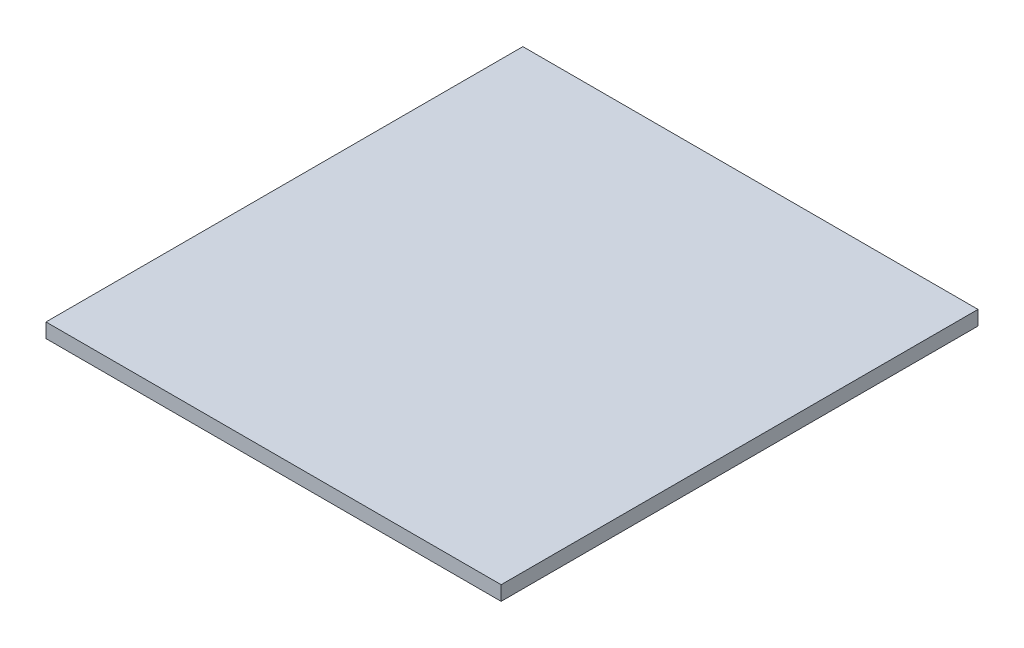
ISO-10303-21;
HEADER;
FILE_DESCRIPTION(('STEP AP214'),'2;1');
FILE_NAME('part.step','',(''),(''),'','','');
FILE_SCHEMA(('AUTOMOTIVE_DESIGN { 1 0 10303 214 1 1 1 1 }'));
ENDSEC;
DATA;
#1=APPLICATION_CONTEXT('core data for automotive mechanical design processes');
#2=APPLICATION_PROTOCOL_DEFINITION('international standard','automotive_design',2000,#1);
#3=PRODUCT_CONTEXT('',#1,'mechanical');
#4=PRODUCT('Part','Part','',(#3));
#5=PRODUCT_RELATED_PRODUCT_CATEGORY('part','',(#4));
#6=PRODUCT_DEFINITION_FORMATION('','',#4);
#7=PRODUCT_DEFINITION_CONTEXT('part definition',#1,'design');
#8=PRODUCT_DEFINITION('design','',#6,#7);
#9=PRODUCT_DEFINITION_SHAPE('','',#8);
#10=(LENGTH_UNIT() NAMED_UNIT(*) SI_UNIT(.MILLI.,.METRE.));
#11=(NAMED_UNIT(*) PLANE_ANGLE_UNIT() SI_UNIT($,.RADIAN.));
#12=(NAMED_UNIT(*) SI_UNIT($,.STERADIAN.) SOLID_ANGLE_UNIT());
#13=UNCERTAINTY_MEASURE_WITH_UNIT(LENGTH_MEASURE(1.E-05),#10,'distance_accuracy_value','');
#14=(GEOMETRIC_REPRESENTATION_CONTEXT(3) GLOBAL_UNCERTAINTY_ASSIGNED_CONTEXT((#13)) GLOBAL_UNIT_ASSIGNED_CONTEXT((#10,
#11,#12)) REPRESENTATION_CONTEXT('',''));
#15=CARTESIAN_POINT('',(0.,0.,0.));
#16=DIRECTION('',(0.,0.,1.));
#17=DIRECTION('',(1.,0.,0.));
#18=AXIS2_PLACEMENT_3D('',#15,#16,#17);
#19=CARTESIAN_POINT('',(100.,3.175,104.775));
#20=DIRECTION('',(-1.,0.,0.));
#21=DIRECTION('',(0.,0.,1.));
#22=AXIS2_PLACEMENT_3D('',#19,#20,#21);
#23=PLANE('',#22);
#24=DIRECTION('',(0.,0.,-1.));
#25=VECTOR('',#24,1.);
#26=CARTESIAN_POINT('',(100.,-3.175,104.775));
#27=LINE('',#26,#25);
#28=CARTESIAN_POINT('',(100.,-3.175,104.775));
#29=VERTEX_POINT('',#28);
#30=CARTESIAN_POINT('',(100.,-3.175,-104.775));
#31=VERTEX_POINT('',#30);
#32=EDGE_CURVE('E111',#29,#31,#27,.T.);
#33=ORIENTED_EDGE('',*,*,#32,.T.);
#34=DIRECTION('',(0.,-1.,0.));
#35=VECTOR('',#34,1.);
#36=CARTESIAN_POINT('',(100.,3.175,-104.775));
#37=LINE('',#36,#35);
#38=CARTESIAN_POINT('',(100.,3.175,-104.775));
#39=VERTEX_POINT('',#38);
#40=EDGE_CURVE('E11',#39,#31,#37,.T.);
#41=ORIENTED_EDGE('',*,*,#40,.F.);
#42=DIRECTION('',(0.,0.,-1.));
#43=VECTOR('',#42,1.);
#44=CARTESIAN_POINT('',(100.,3.175,104.775));
#45=LINE('',#44,#43);
#46=CARTESIAN_POINT('',(100.,3.175,104.775));
#47=VERTEX_POINT('',#46);
#48=EDGE_CURVE('E95',#47,#39,#45,.T.);
#49=ORIENTED_EDGE('',*,*,#48,.F.);
#50=DIRECTION('',(0.,-1.,0.));
#51=VECTOR('',#50,1.);
#52=CARTESIAN_POINT('',(100.,3.175,104.775));
#53=LINE('',#52,#51);
#54=EDGE_CURVE('E107',#47,#29,#53,.T.);
#55=ORIENTED_EDGE('',*,*,#54,.T.);
#56=EDGE_LOOP('',(#33,#41,#49,#55));
#57=FACE_BOUND('',#56,.T.);
#58=ADVANCED_FACE('F43',(#57),#23,.F.);
#59=CARTESIAN_POINT('',(-100.,3.175,-104.775));
#60=DIRECTION('',(0.,0.,1.));
#61=DIRECTION('',(1.,0.,0.));
#62=AXIS2_PLACEMENT_3D('',#59,#60,#61);
#63=PLANE('',#62);
#64=DIRECTION('',(-1.,0.,0.));
#65=VECTOR('',#64,1.);
#66=CARTESIAN_POINT('',(-100.,-3.175,-104.775));
#67=LINE('',#66,#65);
#68=CARTESIAN_POINT('',(-100.,-3.175,-104.775));
#69=VERTEX_POINT('',#68);
#70=EDGE_CURVE('E100',#31,#69,#67,.T.);
#71=ORIENTED_EDGE('',*,*,#70,.T.);
#72=DIRECTION('',(0.,-1.,0.));
#73=VECTOR('',#72,1.);
#74=CARTESIAN_POINT('',(-100.,3.175,-104.775));
#75=LINE('',#74,#73);
#76=CARTESIAN_POINT('',(-100.,3.175,-104.775));
#77=VERTEX_POINT('',#76);
#78=EDGE_CURVE('E52',#77,#69,#75,.T.);
#79=ORIENTED_EDGE('',*,*,#78,.F.);
#80=DIRECTION('',(-1.,0.,0.));
#81=VECTOR('',#80,1.);
#82=CARTESIAN_POINT('',(-100.,3.175,-104.775));
#83=LINE('',#82,#81);
#84=EDGE_CURVE('E90',#39,#77,#83,.T.);
#85=ORIENTED_EDGE('',*,*,#84,.F.);
#86=ORIENTED_EDGE('',*,*,#40,.T.);
#87=EDGE_LOOP('',(#71,#79,#85,#86));
#88=FACE_BOUND('',#87,.T.);
#89=ADVANCED_FACE('F99',(#88),#63,.F.);
#90=CARTESIAN_POINT('',(-100.,3.175,104.775));
#91=DIRECTION('',(1.,0.,0.));
#92=DIRECTION('',(0.,0.,-1.));
#93=AXIS2_PLACEMENT_3D('',#90,#91,#92);
#94=PLANE('',#93);
#95=DIRECTION('',(0.,0.,1.));
#96=VECTOR('',#95,1.);
#97=CARTESIAN_POINT('',(-100.,-3.175,104.775));
#98=LINE('',#97,#96);
#99=CARTESIAN_POINT('',(-100.,-3.175,104.775));
#100=VERTEX_POINT('',#99);
#101=EDGE_CURVE('E77',#69,#100,#98,.T.);
#102=ORIENTED_EDGE('',*,*,#101,.T.);
#103=DIRECTION('',(0.,-1.,0.));
#104=VECTOR('',#103,1.);
#105=CARTESIAN_POINT('',(-100.,3.175,104.775));
#106=LINE('',#105,#104);
#107=CARTESIAN_POINT('',(-100.,3.175,104.775));
#108=VERTEX_POINT('',#107);
#109=EDGE_CURVE('E102',#108,#100,#106,.T.);
#110=ORIENTED_EDGE('',*,*,#109,.F.);
#111=DIRECTION('',(0.,0.,1.));
#112=VECTOR('',#111,1.);
#113=CARTESIAN_POINT('',(-100.,3.175,104.775));
#114=LINE('',#113,#112);
#115=EDGE_CURVE('E93',#77,#108,#114,.T.);
#116=ORIENTED_EDGE('',*,*,#115,.F.);
#117=ORIENTED_EDGE('',*,*,#78,.T.);
#118=EDGE_LOOP('',(#102,#110,#116,#117));
#119=FACE_BOUND('',#118,.T.);
#120=ADVANCED_FACE('F103',(#119),#94,.F.);
#121=CARTESIAN_POINT('',(-100.,3.175,104.775));
#122=DIRECTION('',(0.,0.,-1.));
#123=DIRECTION('',(-1.,0.,0.));
#124=AXIS2_PLACEMENT_3D('',#121,#122,#123);
#125=PLANE('',#124);
#126=DIRECTION('',(1.,0.,0.));
#127=VECTOR('',#126,1.);
#128=CARTESIAN_POINT('',(-100.,-3.175,104.775));
#129=LINE('',#128,#127);
#130=EDGE_CURVE('E83',#100,#29,#129,.T.);
#131=ORIENTED_EDGE('',*,*,#130,.T.);
#132=ORIENTED_EDGE('',*,*,#54,.F.);
#133=DIRECTION('',(1.,0.,0.));
#134=VECTOR('',#133,1.);
#135=CARTESIAN_POINT('',(-100.,3.175,104.775));
#136=LINE('',#135,#134);
#137=EDGE_CURVE('E60',#108,#47,#136,.T.);
#138=ORIENTED_EDGE('',*,*,#137,.F.);
#139=ORIENTED_EDGE('',*,*,#109,.T.);
#140=EDGE_LOOP('',(#131,#132,#138,#139));
#141=FACE_BOUND('',#140,.T.);
#142=ADVANCED_FACE('F124',(#141),#125,.F.);
#143=CARTESIAN_POINT('',(0.,3.175,0.));
#144=DIRECTION('',(0.,-1.,0.));
#145=DIRECTION('',(0.,0.,-1.));
#146=AXIS2_PLACEMENT_3D('',#143,#144,#145);
#147=PLANE('',#146);
#148=ORIENTED_EDGE('',*,*,#48,.T.);
#149=ORIENTED_EDGE('',*,*,#84,.T.);
#150=ORIENTED_EDGE('',*,*,#115,.T.);
#151=ORIENTED_EDGE('',*,*,#137,.T.);
#152=EDGE_LOOP('',(#148,#149,#150,#151));
#153=FACE_BOUND('',#152,.T.);
#154=ADVANCED_FACE('F91',(#153),#147,.F.);
#155=CARTESIAN_POINT('',(0.,-3.175,0.));
#156=DIRECTION('',(0.,-1.,0.));
#157=DIRECTION('',(0.,0.,-1.));
#158=AXIS2_PLACEMENT_3D('',#155,#156,#157);
#159=PLANE('',#158);
#160=ORIENTED_EDGE('',*,*,#32,.F.);
#161=ORIENTED_EDGE('',*,*,#130,.F.);
#162=ORIENTED_EDGE('',*,*,#101,.F.);
#163=ORIENTED_EDGE('',*,*,#70,.F.);
#164=EDGE_LOOP('',(#160,#161,#162,#163));
#165=FACE_BOUND('',#164,.T.);
#166=ADVANCED_FACE('F127',(#165),#159,.T.);
#167=CLOSED_SHELL('',(#58,#89,#120,#142,#154,#166));
#168=MANIFOLD_SOLID_BREP('B2',#167);
#169=ADVANCED_BREP_SHAPE_REPRESENTATION('',(#18,#168),#14);
#170=SHAPE_DEFINITION_REPRESENTATION(#9,#169);
ENDSEC;
END-ISO-10303-21;
